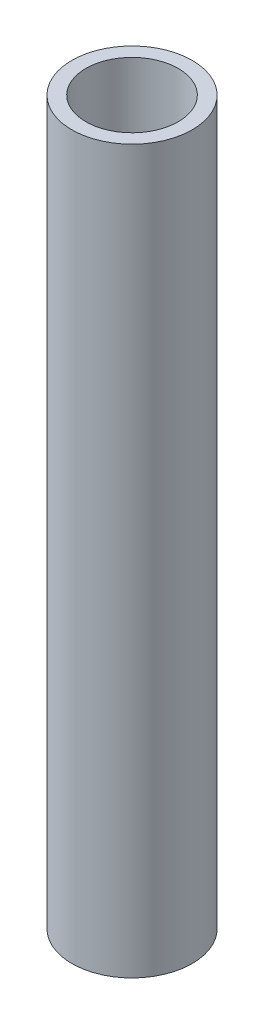
ISO-10303-21;
HEADER;
FILE_DESCRIPTION(('STEP AP214'),'2;1');
FILE_NAME('part.step','',(''),(''),'','','');
FILE_SCHEMA(('AUTOMOTIVE_DESIGN { 1 0 10303 214 1 1 1 1 }'));
ENDSEC;
DATA;
#1=APPLICATION_CONTEXT('core data for automotive mechanical design processes');
#2=APPLICATION_PROTOCOL_DEFINITION('international standard','automotive_design',2000,#1);
#3=PRODUCT_CONTEXT('',#1,'mechanical');
#4=PRODUCT('Part','Part','',(#3));
#5=PRODUCT_RELATED_PRODUCT_CATEGORY('part','',(#4));
#6=PRODUCT_DEFINITION_FORMATION('','',#4);
#7=PRODUCT_DEFINITION_CONTEXT('part definition',#1,'design');
#8=PRODUCT_DEFINITION('design','',#6,#7);
#9=PRODUCT_DEFINITION_SHAPE('','',#8);
#10=(LENGTH_UNIT() NAMED_UNIT(*) SI_UNIT(.MILLI.,.METRE.));
#11=(NAMED_UNIT(*) PLANE_ANGLE_UNIT() SI_UNIT($,.RADIAN.));
#12=(NAMED_UNIT(*) SI_UNIT($,.STERADIAN.) SOLID_ANGLE_UNIT());
#13=UNCERTAINTY_MEASURE_WITH_UNIT(LENGTH_MEASURE(1.E-05),#10,'distance_accuracy_value','');
#14=(GEOMETRIC_REPRESENTATION_CONTEXT(3) GLOBAL_UNCERTAINTY_ASSIGNED_CONTEXT((#13)) GLOBAL_UNIT_ASSIGNED_CONTEXT((#10,
#11,#12)) REPRESENTATION_CONTEXT('',''));
#15=CARTESIAN_POINT('',(0.,0.,0.));
#16=DIRECTION('',(0.,0.,1.));
#17=DIRECTION('',(1.,0.,0.));
#18=AXIS2_PLACEMENT_3D('',#15,#16,#17);
#19=CARTESIAN_POINT('',(0.,38.1,0.));
#20=DIRECTION('',(0.,1.,0.));
#21=DIRECTION('',(0.,0.,1.));
#22=AXIS2_PLACEMENT_3D('',#19,#20,#21);
#23=PLANE('',#22);
#24=CARTESIAN_POINT('',(0.,38.1,0.));
#25=DIRECTION('',(0.,1.,0.));
#26=DIRECTION('',(0.,0.,1.));
#27=AXIS2_PLACEMENT_3D('',#24,#25,#26);
#28=CIRCLE('',#27,6.35);
#29=CARTESIAN_POINT('',(0.,38.1,-6.35));
#30=VERTEX_POINT('',#29);
#31=EDGE_CURVE('E10',#30,#30,#28,.T.);
#32=ORIENTED_EDGE('',*,*,#31,.T.);
#33=EDGE_LOOP('',(#32));
#34=FACE_BOUND('',#33,.T.);
#35=CARTESIAN_POINT('',(0.,38.1,0.));
#36=DIRECTION('',(0.,1.,0.));
#37=DIRECTION('',(0.,0.,1.));
#38=AXIS2_PLACEMENT_3D('',#35,#36,#37);
#39=CIRCLE('',#38,4.8768);
#40=CARTESIAN_POINT('',(0.,38.1,-4.8768));
#41=VERTEX_POINT('',#40);
#42=EDGE_CURVE('E56',#41,#41,#39,.T.);
#43=ORIENTED_EDGE('',*,*,#42,.F.);
#44=EDGE_LOOP('',(#43));
#45=FACE_BOUND('',#44,.T.);
#46=ADVANCED_FACE('F43',(#34,#45),#23,.T.);
#47=CARTESIAN_POINT('',(0.,-38.1,0.));
#48=DIRECTION('',(0.,1.,0.));
#49=DIRECTION('',(0.,0.,1.));
#50=AXIS2_PLACEMENT_3D('',#47,#48,#49);
#51=PLANE('',#50);
#52=CARTESIAN_POINT('',(0.,-38.1,0.));
#53=DIRECTION('',(0.,1.,0.));
#54=DIRECTION('',(0.,0.,1.));
#55=AXIS2_PLACEMENT_3D('',#52,#53,#54);
#56=CIRCLE('',#55,6.35);
#57=CARTESIAN_POINT('',(0.,-38.1,-6.35));
#58=VERTEX_POINT('',#57);
#59=EDGE_CURVE('E47',#58,#58,#56,.T.);
#60=ORIENTED_EDGE('',*,*,#59,.F.);
#61=EDGE_LOOP('',(#60));
#62=FACE_BOUND('',#61,.T.);
#63=CARTESIAN_POINT('',(0.,-38.1,0.));
#64=DIRECTION('',(0.,1.,0.));
#65=DIRECTION('',(0.,0.,1.));
#66=AXIS2_PLACEMENT_3D('',#63,#64,#65);
#67=CIRCLE('',#66,4.8768);
#68=CARTESIAN_POINT('',(0.,-38.1,-4.8768));
#69=VERTEX_POINT('',#68);
#70=EDGE_CURVE('E58',#69,#69,#67,.T.);
#71=ORIENTED_EDGE('',*,*,#70,.T.);
#72=EDGE_LOOP('',(#71));
#73=FACE_BOUND('',#72,.T.);
#74=ADVANCED_FACE('F70',(#62,#73),#51,.F.);
#75=CARTESIAN_POINT('',(0.,38.1,0.));
#76=DIRECTION('',(0.,-1.,0.));
#77=DIRECTION('',(0.,0.,-1.));
#78=AXIS2_PLACEMENT_3D('',#75,#76,#77);
#79=CYLINDRICAL_SURFACE('',#78,6.35);
#80=CARTESIAN_POINT('',(0.,38.1,-6.35));
#81=CARTESIAN_POINT('',(0.,37.30625,-6.35));
#82=CARTESIAN_POINT('',(0.,36.5125,-6.35));
#83=CARTESIAN_POINT('',(0.,34.925,-6.35));
#84=CARTESIAN_POINT('',(0.,34.13125,-6.35));
#85=CARTESIAN_POINT('',(0.,32.54375,-6.35));
#86=CARTESIAN_POINT('',(0.,31.75,-6.35));
#87=CARTESIAN_POINT('',(0.,30.1625,-6.35));
#88=CARTESIAN_POINT('',(0.,29.36875,-6.35));
#89=CARTESIAN_POINT('',(0.,27.78125,-6.35));
#90=CARTESIAN_POINT('',(0.,26.9875,-6.35));
#91=CARTESIAN_POINT('',(0.,25.4,-6.35));
#92=CARTESIAN_POINT('',(0.,24.60625,-6.35));
#93=CARTESIAN_POINT('',(0.,23.01875,-6.35));
#94=CARTESIAN_POINT('',(0.,22.225,-6.35));
#95=CARTESIAN_POINT('',(0.,20.6375,-6.35));
#96=CARTESIAN_POINT('',(0.,19.84375,-6.35));
#97=CARTESIAN_POINT('',(0.,18.25625,-6.35));
#98=CARTESIAN_POINT('',(0.,17.4625,-6.35));
#99=CARTESIAN_POINT('',(0.,15.875,-6.35));
#100=CARTESIAN_POINT('',(0.,15.08125,-6.35));
#101=CARTESIAN_POINT('',(0.,13.49375,-6.35));
#102=CARTESIAN_POINT('',(0.,12.7,-6.35));
#103=CARTESIAN_POINT('',(0.,11.1125,-6.35));
#104=CARTESIAN_POINT('',(0.,10.31875,-6.35));
#105=CARTESIAN_POINT('',(0.,8.73124999999999,-6.35));
#106=CARTESIAN_POINT('',(0.,7.93749999999999,-6.35));
#107=CARTESIAN_POINT('',(0.,6.35,-6.35));
#108=CARTESIAN_POINT('',(0.,5.55625,-6.35));
#109=CARTESIAN_POINT('',(0.,3.96875,-6.35));
#110=CARTESIAN_POINT('',(0.,3.175,-6.35));
#111=CARTESIAN_POINT('',(0.,1.5875,-6.35));
#112=CARTESIAN_POINT('',(0.,0.793750000000001,-6.35));
#113=CARTESIAN_POINT('',(0.,-0.793750000000001,-6.35));
#114=CARTESIAN_POINT('',(0.,-1.5875,-6.35));
#115=CARTESIAN_POINT('',(0.,-3.175,-6.35));
#116=CARTESIAN_POINT('',(0.,-3.96875,-6.35));
#117=CARTESIAN_POINT('',(0.,-5.55625,-6.35));
#118=CARTESIAN_POINT('',(0.,-6.35,-6.35));
#119=CARTESIAN_POINT('',(0.,-7.93750000000001,-6.35));
#120=CARTESIAN_POINT('',(0.,-8.73125,-6.35));
#121=CARTESIAN_POINT('',(0.,-10.31875,-6.35));
#122=CARTESIAN_POINT('',(0.,-11.1125,-6.35));
#123=CARTESIAN_POINT('',(0.,-12.7,-6.35));
#124=CARTESIAN_POINT('',(0.,-13.49375,-6.35));
#125=CARTESIAN_POINT('',(0.,-15.08125,-6.35));
#126=CARTESIAN_POINT('',(0.,-15.875,-6.35));
#127=CARTESIAN_POINT('',(0.,-17.4625,-6.35));
#128=CARTESIAN_POINT('',(0.,-18.25625,-6.35));
#129=CARTESIAN_POINT('',(0.,-19.84375,-6.35));
#130=CARTESIAN_POINT('',(0.,-20.6375,-6.35));
#131=CARTESIAN_POINT('',(0.,-22.225,-6.35));
#132=CARTESIAN_POINT('',(0.,-23.01875,-6.35));
#133=CARTESIAN_POINT('',(0.,-24.60625,-6.35));
#134=CARTESIAN_POINT('',(0.,-25.4,-6.35));
#135=CARTESIAN_POINT('',(0.,-26.9875,-6.35));
#136=CARTESIAN_POINT('',(0.,-27.78125,-6.35));
#137=CARTESIAN_POINT('',(0.,-29.36875,-6.35));
#138=CARTESIAN_POINT('',(0.,-30.1625,-6.35));
#139=CARTESIAN_POINT('',(0.,-31.75,-6.35));
#140=CARTESIAN_POINT('',(0.,-32.54375,-6.35));
#141=CARTESIAN_POINT('',(0.,-34.13125,-6.35));
#142=CARTESIAN_POINT('',(0.,-34.925,-6.35));
#143=CARTESIAN_POINT('',(0.,-36.5125,-6.35));
#144=CARTESIAN_POINT('',(0.,-37.30625,-6.35));
#145=CARTESIAN_POINT('',(0.,-38.1,-6.35));
#146=B_SPLINE_CURVE_WITH_KNOTS('',3,(#80,#81,#82,#83,#84,#85,#86,#87,#88,#89,#90,#91,#92,#93,
#94,#95,#96,#97,#98,#99,#100,#101,#102,#103,#104,#105,#106,#107,#108,#109,#110,#111,#112,#113,
#114,#115,#116,#117,#118,#119,#120,#121,#122,#123,#124,#125,#126,#127,#128,#129,#130,#131,#132,
#133,#134,#135,#136,#137,#138,#139,#140,#141,#142,#143,#144,#145),.UNSPECIFIED.,.F.,.F.,(4,2,2,
2,2,2,2,2,2,2,2,2,2,2,2,2,2,2,2,2,2,2,2,2,2,2,2,2,2,2,2,2,4),(0.,2.38125,4.7625,7.14375,
9.52500000000001,11.90625,14.2875,16.66875,19.05,21.43125,23.8125,26.19375,28.575,30.95625,
33.3375,35.71875,38.1,40.48125,42.8625,45.24375,47.625,50.00625,52.3875,54.76875,57.15,59.53125,
61.9125,64.29375,66.675,69.05625,71.4375,73.81875,76.2),.UNSPECIFIED.);
#147=EDGE_CURVE('BSEAM45',#30,#58,#146,.T.);
#148=ORIENTED_EDGE('',*,*,#31,.F.);
#149=ORIENTED_EDGE('',*,*,#59,.T.);
#150=ORIENTED_EDGE('',*,*,#147,.T.);
#151=ORIENTED_EDGE('',*,*,#147,.F.);
#152=EDGE_LOOP('',(#148,#150,#149,#151));
#153=FACE_BOUND('',#152,.T.);
#154=ADVANCED_FACE('F45',(#153),#79,.T.);
#155=CARTESIAN_POINT('',(0.,38.1,0.));
#156=DIRECTION('',(0.,-1.,0.));
#157=DIRECTION('',(0.,0.,-1.));
#158=AXIS2_PLACEMENT_3D('',#155,#156,#157);
#159=CYLINDRICAL_SURFACE('',#158,4.8768);
#160=CARTESIAN_POINT('',(0.,38.1,-4.8768));
#161=CARTESIAN_POINT('',(0.,37.30625,-4.8768));
#162=CARTESIAN_POINT('',(0.,36.5125,-4.8768));
#163=CARTESIAN_POINT('',(0.,34.925,-4.8768));
#164=CARTESIAN_POINT('',(0.,34.13125,-4.8768));
#165=CARTESIAN_POINT('',(0.,32.54375,-4.8768));
#166=CARTESIAN_POINT('',(0.,31.75,-4.8768));
#167=CARTESIAN_POINT('',(0.,30.1625,-4.8768));
#168=CARTESIAN_POINT('',(0.,29.36875,-4.8768));
#169=CARTESIAN_POINT('',(0.,27.78125,-4.8768));
#170=CARTESIAN_POINT('',(0.,26.9875,-4.8768));
#171=CARTESIAN_POINT('',(0.,25.4,-4.8768));
#172=CARTESIAN_POINT('',(0.,24.60625,-4.8768));
#173=CARTESIAN_POINT('',(0.,23.01875,-4.8768));
#174=CARTESIAN_POINT('',(0.,22.225,-4.8768));
#175=CARTESIAN_POINT('',(0.,20.6375,-4.8768));
#176=CARTESIAN_POINT('',(0.,19.84375,-4.8768));
#177=CARTESIAN_POINT('',(0.,18.25625,-4.8768));
#178=CARTESIAN_POINT('',(0.,17.4625,-4.8768));
#179=CARTESIAN_POINT('',(0.,15.875,-4.8768));
#180=CARTESIAN_POINT('',(0.,15.08125,-4.8768));
#181=CARTESIAN_POINT('',(0.,13.49375,-4.8768));
#182=CARTESIAN_POINT('',(0.,12.7,-4.8768));
#183=CARTESIAN_POINT('',(0.,11.1125,-4.8768));
#184=CARTESIAN_POINT('',(0.,10.31875,-4.8768));
#185=CARTESIAN_POINT('',(0.,8.73124999999999,-4.8768));
#186=CARTESIAN_POINT('',(0.,7.93749999999999,-4.8768));
#187=CARTESIAN_POINT('',(0.,6.35,-4.8768));
#188=CARTESIAN_POINT('',(0.,5.55625,-4.8768));
#189=CARTESIAN_POINT('',(0.,3.96875,-4.8768));
#190=CARTESIAN_POINT('',(0.,3.175,-4.8768));
#191=CARTESIAN_POINT('',(0.,1.5875,-4.8768));
#192=CARTESIAN_POINT('',(0.,0.793750000000001,-4.8768));
#193=CARTESIAN_POINT('',(0.,-0.793750000000001,-4.8768));
#194=CARTESIAN_POINT('',(0.,-1.5875,-4.8768));
#195=CARTESIAN_POINT('',(0.,-3.175,-4.8768));
#196=CARTESIAN_POINT('',(0.,-3.96875,-4.8768));
#197=CARTESIAN_POINT('',(0.,-5.55625,-4.8768));
#198=CARTESIAN_POINT('',(0.,-6.35,-4.8768));
#199=CARTESIAN_POINT('',(0.,-7.93750000000001,-4.8768));
#200=CARTESIAN_POINT('',(0.,-8.73125,-4.8768));
#201=CARTESIAN_POINT('',(0.,-10.31875,-4.8768));
#202=CARTESIAN_POINT('',(0.,-11.1125,-4.8768));
#203=CARTESIAN_POINT('',(0.,-12.7,-4.8768));
#204=CARTESIAN_POINT('',(0.,-13.49375,-4.8768));
#205=CARTESIAN_POINT('',(0.,-15.08125,-4.8768));
#206=CARTESIAN_POINT('',(0.,-15.875,-4.8768));
#207=CARTESIAN_POINT('',(0.,-17.4625,-4.8768));
#208=CARTESIAN_POINT('',(0.,-18.25625,-4.8768));
#209=CARTESIAN_POINT('',(0.,-19.84375,-4.8768));
#210=CARTESIAN_POINT('',(0.,-20.6375,-4.8768));
#211=CARTESIAN_POINT('',(0.,-22.225,-4.8768));
#212=CARTESIAN_POINT('',(0.,-23.01875,-4.8768));
#213=CARTESIAN_POINT('',(0.,-24.60625,-4.8768));
#214=CARTESIAN_POINT('',(0.,-25.4,-4.8768));
#215=CARTESIAN_POINT('',(0.,-26.9875,-4.8768));
#216=CARTESIAN_POINT('',(0.,-27.78125,-4.8768));
#217=CARTESIAN_POINT('',(0.,-29.36875,-4.8768));
#218=CARTESIAN_POINT('',(0.,-30.1625,-4.8768));
#219=CARTESIAN_POINT('',(0.,-31.75,-4.8768));
#220=CARTESIAN_POINT('',(0.,-32.54375,-4.8768));
#221=CARTESIAN_POINT('',(0.,-34.13125,-4.8768));
#222=CARTESIAN_POINT('',(0.,-34.925,-4.8768));
#223=CARTESIAN_POINT('',(0.,-36.5125,-4.8768));
#224=CARTESIAN_POINT('',(0.,-37.30625,-4.8768));
#225=CARTESIAN_POINT('',(0.,-38.1,-4.8768));
#226=B_SPLINE_CURVE_WITH_KNOTS('',3,(#160,#161,#162,#163,#164,#165,#166,#167,#168,#169,#170,
#171,#172,#173,#174,#175,#176,#177,#178,#179,#180,#181,#182,#183,#184,#185,#186,#187,#188,#189,
#190,#191,#192,#193,#194,#195,#196,#197,#198,#199,#200,#201,#202,#203,#204,#205,#206,#207,#208,
#209,#210,#211,#212,#213,#214,#215,#216,#217,#218,#219,#220,#221,#222,#223,#224,#225),
.UNSPECIFIED.,.F.,.F.,(4,2,2,2,2,2,2,2,2,2,2,2,2,2,2,2,2,2,2,2,2,2,2,2,2,2,2,2,2,2,2,2,4),(0.,
2.38125,4.7625,7.14375,9.52500000000001,11.90625,14.2875,16.66875,19.05,21.43125,23.8125,
26.19375,28.575,30.95625,33.3375,35.71875,38.1,40.48125,42.8625,45.24375,47.625,50.00625,
52.3875,54.76875,57.15,59.53125,61.9125,64.29375,66.675,69.05625,71.4375,73.81875,76.2),.UNSPECIFIED.);
#227=EDGE_CURVE('BSEAM66',#41,#69,#226,.T.);
#228=ORIENTED_EDGE('',*,*,#42,.T.);
#229=ORIENTED_EDGE('',*,*,#70,.F.);
#230=ORIENTED_EDGE('',*,*,#227,.T.);
#231=ORIENTED_EDGE('',*,*,#227,.F.);
#232=EDGE_LOOP('',(#228,#230,#229,#231));
#233=FACE_BOUND('',#232,.T.);
#234=ADVANCED_FACE('F66',(#233),#159,.F.);
#235=CLOSED_SHELL('',(#46,#74,#154,#234));
#236=MANIFOLD_SOLID_BREP('B2',#235);
#237=ADVANCED_BREP_SHAPE_REPRESENTATION('',(#18,#236),#14);
#238=SHAPE_DEFINITION_REPRESENTATION(#9,#237);
ENDSEC;
END-ISO-10303-21;
